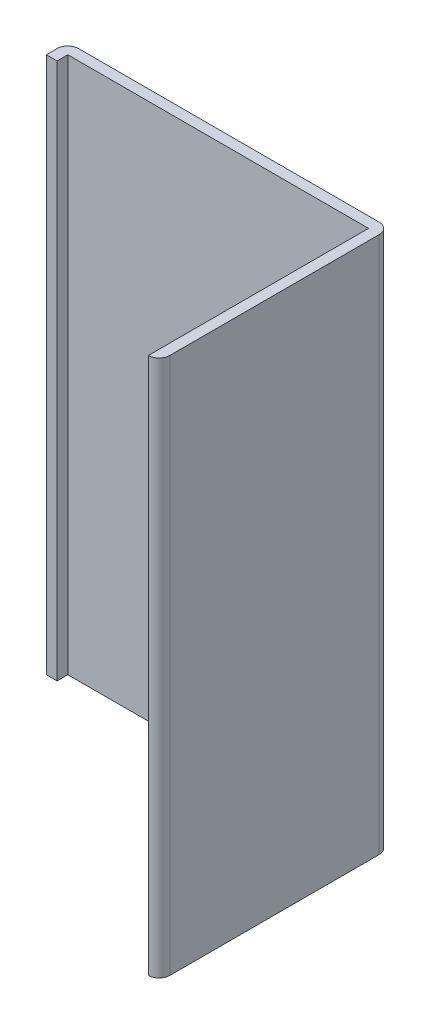
ISO-10303-21;
HEADER;
FILE_DESCRIPTION(('STEP AP214'),'2;1');
FILE_NAME('part.step','',(''),(''),'','','');
FILE_SCHEMA(('AUTOMOTIVE_DESIGN { 1 0 10303 214 1 1 1 1 }'));
ENDSEC;
DATA;
#1=APPLICATION_CONTEXT('core data for automotive mechanical design processes');
#2=APPLICATION_PROTOCOL_DEFINITION('international standard','automotive_design',2000,#1);
#3=PRODUCT_CONTEXT('',#1,'mechanical');
#4=PRODUCT('Part','Part','',(#3));
#5=PRODUCT_RELATED_PRODUCT_CATEGORY('part','',(#4));
#6=PRODUCT_DEFINITION_FORMATION('','',#4);
#7=PRODUCT_DEFINITION_CONTEXT('part definition',#1,'design');
#8=PRODUCT_DEFINITION('design','',#6,#7);
#9=PRODUCT_DEFINITION_SHAPE('','',#8);
#10=(LENGTH_UNIT() NAMED_UNIT(*) SI_UNIT(.MILLI.,.METRE.));
#11=(NAMED_UNIT(*) PLANE_ANGLE_UNIT() SI_UNIT($,.RADIAN.));
#12=(NAMED_UNIT(*) SI_UNIT($,.STERADIAN.) SOLID_ANGLE_UNIT());
#13=UNCERTAINTY_MEASURE_WITH_UNIT(LENGTH_MEASURE(1.E-05),#10,'distance_accuracy_value','');
#14=(GEOMETRIC_REPRESENTATION_CONTEXT(3) GLOBAL_UNCERTAINTY_ASSIGNED_CONTEXT((#13)) GLOBAL_UNIT_ASSIGNED_CONTEXT((#10,
#11,#12)) REPRESENTATION_CONTEXT('',''));
#15=CARTESIAN_POINT('',(0.,0.,0.));
#16=DIRECTION('',(0.,0.,1.));
#17=DIRECTION('',(1.,0.,0.));
#18=AXIS2_PLACEMENT_3D('',#15,#16,#17);
#19=CARTESIAN_POINT('',(-0.0762,-0.635,0.0254));
#20=DIRECTION('',(0.,0.,-1.));
#21=DIRECTION('',(-1.,0.,0.));
#22=AXIS2_PLACEMENT_3D('',#19,#20,#21);
#23=PLANE('',#22);
#24=DIRECTION('',(0.,1.,0.));
#25=VECTOR('',#24,1.);
#26=CARTESIAN_POINT('',(0.635,-0.635,0.0254));
#27=LINE('',#26,#25);
#28=CARTESIAN_POINT('',(0.635,-0.635,0.0254));
#29=VERTEX_POINT('',#28);
#30=CARTESIAN_POINT('',(0.635,0.635,0.0254));
#31=VERTEX_POINT('',#30);
#32=EDGE_CURVE('E125',#29,#31,#27,.T.);
#33=ORIENTED_EDGE('',*,*,#32,.T.);
#34=DIRECTION('',(1.,0.,0.));
#35=VECTOR('',#34,1.);
#36=CARTESIAN_POINT('',(0.635,0.635,0.0254));
#37=LINE('',#36,#35);
#38=CARTESIAN_POINT('',(-0.0762,0.635,0.0254));
#39=VERTEX_POINT('',#38);
#40=EDGE_CURVE('E112',#31,#39,#37,.F.);
#41=ORIENTED_EDGE('',*,*,#40,.T.);
#42=DIRECTION('',(0.,1.,0.));
#43=VECTOR('',#42,1.);
#44=CARTESIAN_POINT('',(-0.0762,-0.635,0.0254));
#45=LINE('',#44,#43);
#46=CARTESIAN_POINT('',(-0.0762,-0.635,0.0254));
#47=VERTEX_POINT('',#46);
#48=EDGE_CURVE('E108',#39,#47,#45,.F.);
#49=ORIENTED_EDGE('',*,*,#48,.T.);
#50=DIRECTION('',(1.,0.,0.));
#51=VECTOR('',#50,1.);
#52=CARTESIAN_POINT('',(0.635,-0.635,0.0254));
#53=LINE('',#52,#51);
#54=EDGE_CURVE('E126',#29,#47,#53,.F.);
#55=ORIENTED_EDGE('',*,*,#54,.F.);
#56=EDGE_LOOP('',(#33,#41,#49,#55));
#57=FACE_BOUND('',#56,.T.);
#58=ADVANCED_FACE('F17',(#57),#23,.F.);
#59=CARTESIAN_POINT('',(-0.0762,-0.635,0.0508));
#60=DIRECTION('',(-1.,0.,0.));
#61=DIRECTION('',(0.,0.,1.));
#62=AXIS2_PLACEMENT_3D('',#59,#60,#61);
#63=PLANE('',#62);
#64=ORIENTED_EDGE('',*,*,#48,.F.);
#65=DIRECTION('',(0.,0.,-1.));
#66=VECTOR('',#65,1.);
#67=CARTESIAN_POINT('',(-0.0762,0.635,0.0254));
#68=LINE('',#67,#66);
#69=CARTESIAN_POINT('',(-0.0762,0.635,0.0508));
#70=VERTEX_POINT('',#69);
#71=EDGE_CURVE('E120',#39,#70,#68,.F.);
#72=ORIENTED_EDGE('',*,*,#71,.T.);
#73=DIRECTION('',(0.,1.,0.));
#74=VECTOR('',#73,1.);
#75=CARTESIAN_POINT('',(-0.0762,-0.635,0.0508));
#76=LINE('',#75,#74);
#77=CARTESIAN_POINT('',(-0.0762,-0.635,0.0508));
#78=VERTEX_POINT('',#77);
#79=EDGE_CURVE('E177',#70,#78,#76,.F.);
#80=ORIENTED_EDGE('',*,*,#79,.T.);
#81=DIRECTION('',(0.,0.,-1.));
#82=VECTOR('',#81,1.);
#83=CARTESIAN_POINT('',(-0.0762,-0.635,0.0254));
#84=LINE('',#83,#82);
#85=EDGE_CURVE('E168',#47,#78,#84,.F.);
#86=ORIENTED_EDGE('',*,*,#85,.F.);
#87=EDGE_LOOP('',(#64,#72,#80,#86));
#88=FACE_BOUND('',#87,.T.);
#89=ADVANCED_FACE('F227',(#88),#63,.F.);
#90=CARTESIAN_POINT('',(-0.1016,-0.635,0.0508));
#91=DIRECTION('',(0.,0.,-1.));
#92=DIRECTION('',(-1.,0.,0.));
#93=AXIS2_PLACEMENT_3D('',#90,#91,#92);
#94=PLANE('',#93);
#95=ORIENTED_EDGE('',*,*,#79,.F.);
#96=DIRECTION('',(1.,0.,0.));
#97=VECTOR('',#96,1.);
#98=CARTESIAN_POINT('',(0.635,0.635,0.0508));
#99=LINE('',#98,#97);
#100=CARTESIAN_POINT('',(-0.1016,0.635,0.0508));
#101=VERTEX_POINT('',#100);
#102=EDGE_CURVE('E145',#70,#101,#99,.F.);
#103=ORIENTED_EDGE('',*,*,#102,.T.);
#104=DIRECTION('',(0.,1.,0.));
#105=VECTOR('',#104,1.);
#106=CARTESIAN_POINT('',(-0.1016,-0.635,0.0508));
#107=LINE('',#106,#105);
#108=CARTESIAN_POINT('',(-0.1016,-0.635,0.0508));
#109=VERTEX_POINT('',#108);
#110=EDGE_CURVE('E184',#101,#109,#107,.F.);
#111=ORIENTED_EDGE('',*,*,#110,.T.);
#112=DIRECTION('',(1.,0.,0.));
#113=VECTOR('',#112,1.);
#114=CARTESIAN_POINT('',(0.635,-0.635,0.0508));
#115=LINE('',#114,#113);
#116=EDGE_CURVE('E86',#78,#109,#115,.F.);
#117=ORIENTED_EDGE('',*,*,#116,.F.);
#118=EDGE_LOOP('',(#95,#103,#111,#117));
#119=FACE_BOUND('',#118,.T.);
#120=ADVANCED_FACE('F226',(#119),#94,.F.);
#121=CARTESIAN_POINT('',(-0.1016,-0.635,0.0254));
#122=DIRECTION('',(1.,0.,0.));
#123=DIRECTION('',(0.,0.,-1.));
#124=AXIS2_PLACEMENT_3D('',#121,#122,#123);
#125=PLANE('',#124);
#126=ORIENTED_EDGE('',*,*,#110,.F.);
#127=DIRECTION('',(0.,0.,-1.));
#128=VECTOR('',#127,1.);
#129=CARTESIAN_POINT('',(-0.1016,0.635,0.0254));
#130=LINE('',#129,#128);
#131=CARTESIAN_POINT('',(-0.1016,0.635,0.0254));
#132=VERTEX_POINT('',#131);
#133=EDGE_CURVE('E148',#101,#132,#130,.T.);
#134=ORIENTED_EDGE('',*,*,#133,.T.);
#135=DIRECTION('',(0.,-1.,0.));
#136=VECTOR('',#135,1.);
#137=CARTESIAN_POINT('',(-0.1016,-0.635,0.0254));
#138=LINE('',#137,#136);
#139=CARTESIAN_POINT('',(-0.1016,-0.635,0.0254));
#140=VERTEX_POINT('',#139);
#141=EDGE_CURVE('E134',#140,#132,#138,.F.);
#142=ORIENTED_EDGE('',*,*,#141,.F.);
#143=DIRECTION('',(0.,0.,-1.));
#144=VECTOR('',#143,1.);
#145=CARTESIAN_POINT('',(-0.1016,-0.635,0.0254));
#146=LINE('',#145,#144);
#147=EDGE_CURVE('E80',#109,#140,#146,.T.);
#148=ORIENTED_EDGE('',*,*,#147,.F.);
#149=EDGE_LOOP('',(#126,#134,#142,#148));
#150=FACE_BOUND('',#149,.T.);
#151=ADVANCED_FACE('F224',(#150),#125,.F.);
#152=CARTESIAN_POINT('',(0.6604,-0.635,0.5207));
#153=DIRECTION('',(-1.,0.,0.));
#154=DIRECTION('',(0.,0.,1.));
#155=AXIS2_PLACEMENT_3D('',#152,#153,#154);
#156=PLANE('',#155);
#157=DIRECTION('',(0.,-1.,0.));
#158=VECTOR('',#157,1.);
#159=CARTESIAN_POINT('',(0.6604,-0.635,0.0254));
#160=LINE('',#159,#158);
#161=CARTESIAN_POINT('',(0.6604,0.635,0.0254));
#162=VERTEX_POINT('',#161);
#163=CARTESIAN_POINT('',(0.6604,-0.635,0.0254));
#164=VERTEX_POINT('',#163);
#165=EDGE_CURVE('E74',#162,#164,#160,.T.);
#166=ORIENTED_EDGE('',*,*,#165,.F.);
#167=DIRECTION('',(0.,0.,-1.));
#168=VECTOR('',#167,1.);
#169=CARTESIAN_POINT('',(0.6604,0.635,0.0254));
#170=LINE('',#169,#168);
#171=CARTESIAN_POINT('',(0.6604,0.635,0.5207));
#172=VERTEX_POINT('',#171);
#173=EDGE_CURVE('E139',#162,#172,#170,.F.);
#174=ORIENTED_EDGE('',*,*,#173,.T.);
#175=DIRECTION('',(0.,-1.,0.));
#176=VECTOR('',#175,1.);
#177=CARTESIAN_POINT('',(0.6604,-0.635,0.5207));
#178=LINE('',#177,#176);
#179=CARTESIAN_POINT('',(0.6604,-0.635,0.5207));
#180=VERTEX_POINT('',#179);
#181=EDGE_CURVE('E190',#180,#172,#178,.F.);
#182=ORIENTED_EDGE('',*,*,#181,.F.);
#183=DIRECTION('',(0.,0.,-1.));
#184=VECTOR('',#183,1.);
#185=CARTESIAN_POINT('',(0.6604,-0.635,0.0254));
#186=LINE('',#185,#184);
#187=EDGE_CURVE('E160',#164,#180,#186,.F.);
#188=ORIENTED_EDGE('',*,*,#187,.F.);
#189=EDGE_LOOP('',(#166,#174,#182,#188));
#190=FACE_BOUND('',#189,.T.);
#191=ADVANCED_FACE('F216',(#190),#156,.F.);
#192=CARTESIAN_POINT('',(0.635,-0.635,0.5207));
#193=DIRECTION('',(0.,-1.,0.));
#194=DIRECTION('',(0.,0.,-1.));
#195=AXIS2_PLACEMENT_3D('',#192,#193,#194);
#196=CYLINDRICAL_SURFACE('',#195,0.0254);
#197=CARTESIAN_POINT('',(0.635,0.635,0.5207));
#198=DIRECTION('',(0.,-1.,0.));
#199=DIRECTION('',(0.,0.,-1.));
#200=AXIS2_PLACEMENT_3D('',#197,#198,#199);
#201=CIRCLE('',#200,0.0254);
#202=CARTESIAN_POINT('',(0.635,0.635,0.5461));
#203=VERTEX_POINT('',#202);
#204=EDGE_CURVE('E135',#172,#203,#201,.T.);
#205=ORIENTED_EDGE('',*,*,#204,.T.);
#206=DIRECTION('',(0.,1.,0.));
#207=VECTOR('',#206,1.);
#208=CARTESIAN_POINT('',(0.635,-0.635,0.5461));
#209=LINE('',#208,#207);
#210=CARTESIAN_POINT('',(0.635,-0.635,0.5461));
#211=VERTEX_POINT('',#210);
#212=EDGE_CURVE('E129',#203,#211,#209,.F.);
#213=ORIENTED_EDGE('',*,*,#212,.T.);
#214=CARTESIAN_POINT('',(0.635,-0.635,0.5207));
#215=DIRECTION('',(0.,-1.,0.));
#216=DIRECTION('',(0.,0.,-1.));
#217=AXIS2_PLACEMENT_3D('',#214,#215,#216);
#218=CIRCLE('',#217,0.0254);
#219=EDGE_CURVE('E156',#180,#211,#218,.T.);
#220=ORIENTED_EDGE('',*,*,#219,.F.);
#221=ORIENTED_EDGE('',*,*,#181,.T.);
#222=EDGE_LOOP('',(#205,#213,#220,#221));
#223=FACE_BOUND('',#222,.T.);
#224=ADVANCED_FACE('F218',(#223),#196,.T.);
#225=CARTESIAN_POINT('',(0.635,-0.635,0.0254));
#226=DIRECTION('',(1.,0.,0.));
#227=DIRECTION('',(0.,0.,-1.));
#228=AXIS2_PLACEMENT_3D('',#225,#226,#227);
#229=PLANE('',#228);
#230=DIRECTION('',(0.,0.,-1.));
#231=VECTOR('',#230,1.);
#232=CARTESIAN_POINT('',(0.635,-0.635,0.0254));
#233=LINE('',#232,#231);
#234=EDGE_CURVE('E159',#211,#29,#233,.T.);
#235=ORIENTED_EDGE('',*,*,#234,.F.);
#236=ORIENTED_EDGE('',*,*,#212,.F.);
#237=DIRECTION('',(0.,0.,-1.));
#238=VECTOR('',#237,1.);
#239=CARTESIAN_POINT('',(0.635,0.635,0.0254));
#240=LINE('',#239,#238);
#241=EDGE_CURVE('E117',#203,#31,#240,.T.);
#242=ORIENTED_EDGE('',*,*,#241,.T.);
#243=ORIENTED_EDGE('',*,*,#32,.F.);
#244=EDGE_LOOP('',(#235,#236,#242,#243));
#245=FACE_BOUND('',#244,.T.);
#246=ADVANCED_FACE('F131',(#245),#229,.F.);
#247=CARTESIAN_POINT('',(0.635,-0.635,0.0254));
#248=DIRECTION('',(0.,-1.,0.));
#249=DIRECTION('',(0.,0.,-1.));
#250=AXIS2_PLACEMENT_3D('',#247,#248,#249);
#251=CYLINDRICAL_SURFACE('',#250,0.0254);
#252=CARTESIAN_POINT('',(0.635,0.635,0.0254));
#253=DIRECTION('',(0.,-1.,0.));
#254=DIRECTION('',(0.,0.,-1.));
#255=AXIS2_PLACEMENT_3D('',#252,#253,#254);
#256=CIRCLE('',#255,0.0254);
#257=CARTESIAN_POINT('',(0.635,0.635,0.));
#258=VERTEX_POINT('',#257);
#259=EDGE_CURVE('E20',#258,#162,#256,.T.);
#260=ORIENTED_EDGE('',*,*,#259,.T.);
#261=ORIENTED_EDGE('',*,*,#165,.T.);
#262=CARTESIAN_POINT('',(0.635,-0.635,0.0254));
#263=DIRECTION('',(0.,-1.,0.));
#264=DIRECTION('',(0.,0.,-1.));
#265=AXIS2_PLACEMENT_3D('',#262,#263,#264);
#266=CIRCLE('',#265,0.0254);
#267=CARTESIAN_POINT('',(0.635,-0.635,0.));
#268=VERTEX_POINT('',#267);
#269=EDGE_CURVE('E161',#268,#164,#266,.T.);
#270=ORIENTED_EDGE('',*,*,#269,.F.);
#271=DIRECTION('',(0.,1.,0.));
#272=VECTOR('',#271,1.);
#273=CARTESIAN_POINT('',(0.635,-0.635,0.));
#274=LINE('',#273,#272);
#275=EDGE_CURVE('E64',#268,#258,#274,.T.);
#276=ORIENTED_EDGE('',*,*,#275,.T.);
#277=EDGE_LOOP('',(#260,#261,#270,#276));
#278=FACE_BOUND('',#277,.T.);
#279=ADVANCED_FACE('F219',(#278),#251,.T.);
#280=CARTESIAN_POINT('',(0.635,0.635,0.0254));
#281=DIRECTION('',(0.,-1.,0.));
#282=DIRECTION('',(0.,0.,-1.));
#283=AXIS2_PLACEMENT_3D('',#280,#281,#282);
#284=PLANE('',#283);
#285=ORIENTED_EDGE('',*,*,#241,.F.);
#286=ORIENTED_EDGE('',*,*,#204,.F.);
#287=ORIENTED_EDGE('',*,*,#173,.F.);
#288=ORIENTED_EDGE('',*,*,#259,.F.);
#289=DIRECTION('',(1.,0.,0.));
#290=VECTOR('',#289,1.);
#291=CARTESIAN_POINT('',(0.635,0.635,0.));
#292=LINE('',#291,#290);
#293=CARTESIAN_POINT('',(-0.0762,0.635,0.));
#294=VERTEX_POINT('',#293);
#295=EDGE_CURVE('E204',#258,#294,#292,.F.);
#296=ORIENTED_EDGE('',*,*,#295,.T.);
#297=CARTESIAN_POINT('',(-0.0762,0.635,0.0254));
#298=DIRECTION('',(0.,-1.,0.));
#299=DIRECTION('',(0.,0.,-1.));
#300=AXIS2_PLACEMENT_3D('',#297,#298,#299);
#301=CIRCLE('',#300,0.0254);
#302=EDGE_CURVE('E137',#132,#294,#301,.T.);
#303=ORIENTED_EDGE('',*,*,#302,.F.);
#304=ORIENTED_EDGE('',*,*,#133,.F.);
#305=ORIENTED_EDGE('',*,*,#102,.F.);
#306=ORIENTED_EDGE('',*,*,#71,.F.);
#307=ORIENTED_EDGE('',*,*,#40,.F.);
#308=EDGE_LOOP('',(#285,#286,#287,#288,#296,#303,#304,#305,#306,#307));
#309=FACE_BOUND('',#308,.T.);
#310=ADVANCED_FACE('F114',(#309),#284,.F.);
#311=CARTESIAN_POINT('',(-0.0762,-0.635,0.0254));
#312=DIRECTION('',(0.,-1.,0.));
#313=DIRECTION('',(0.,0.,-1.));
#314=AXIS2_PLACEMENT_3D('',#311,#312,#313);
#315=CYLINDRICAL_SURFACE('',#314,0.0254);
#316=ORIENTED_EDGE('',*,*,#302,.T.);
#317=DIRECTION('',(0.,1.,0.));
#318=VECTOR('',#317,1.);
#319=CARTESIAN_POINT('',(-0.0762,-0.635,0.));
#320=LINE('',#319,#318);
#321=CARTESIAN_POINT('',(-0.0762,-0.635,0.));
#322=VERTEX_POINT('',#321);
#323=EDGE_CURVE('E26',#294,#322,#320,.F.);
#324=ORIENTED_EDGE('',*,*,#323,.T.);
#325=CARTESIAN_POINT('',(-0.0762,-0.635,0.0254));
#326=DIRECTION('',(0.,-1.,0.));
#327=DIRECTION('',(0.,0.,-1.));
#328=AXIS2_PLACEMENT_3D('',#325,#326,#327);
#329=CIRCLE('',#328,0.0254);
#330=EDGE_CURVE('E34',#140,#322,#329,.T.);
#331=ORIENTED_EDGE('',*,*,#330,.F.);
#332=ORIENTED_EDGE('',*,*,#141,.T.);
#333=EDGE_LOOP('',(#316,#324,#331,#332));
#334=FACE_BOUND('',#333,.T.);
#335=ADVANCED_FACE('F221',(#334),#315,.T.);
#336=CARTESIAN_POINT('',(0.635,-0.635,0.0254));
#337=DIRECTION('',(0.,-1.,0.));
#338=DIRECTION('',(0.,0.,-1.));
#339=AXIS2_PLACEMENT_3D('',#336,#337,#338);
#340=PLANE('',#339);
#341=ORIENTED_EDGE('',*,*,#219,.T.);
#342=ORIENTED_EDGE('',*,*,#234,.T.);
#343=ORIENTED_EDGE('',*,*,#54,.T.);
#344=ORIENTED_EDGE('',*,*,#85,.T.);
#345=ORIENTED_EDGE('',*,*,#116,.T.);
#346=ORIENTED_EDGE('',*,*,#147,.T.);
#347=ORIENTED_EDGE('',*,*,#330,.T.);
#348=DIRECTION('',(1.,0.,0.));
#349=VECTOR('',#348,1.);
#350=CARTESIAN_POINT('',(0.635,-0.635,0.));
#351=LINE('',#350,#349);
#352=EDGE_CURVE('E11',#322,#268,#351,.T.);
#353=ORIENTED_EDGE('',*,*,#352,.T.);
#354=ORIENTED_EDGE('',*,*,#269,.T.);
#355=ORIENTED_EDGE('',*,*,#187,.T.);
#356=EDGE_LOOP('',(#341,#342,#343,#344,#345,#346,#347,#353,#354,#355));
#357=FACE_BOUND('',#356,.T.);
#358=ADVANCED_FACE('F213',(#357),#340,.T.);
#359=CARTESIAN_POINT('',(0.635,-0.635,0.));
#360=DIRECTION('',(0.,0.,1.));
#361=DIRECTION('',(1.,0.,0.));
#362=AXIS2_PLACEMENT_3D('',#359,#360,#361);
#363=PLANE('',#362);
#364=ORIENTED_EDGE('',*,*,#323,.F.);
#365=ORIENTED_EDGE('',*,*,#295,.F.);
#366=ORIENTED_EDGE('',*,*,#275,.F.);
#367=ORIENTED_EDGE('',*,*,#352,.F.);
#368=EDGE_LOOP('',(#364,#365,#366,#367));
#369=FACE_BOUND('',#368,.T.);
#370=ADVANCED_FACE('F220',(#369),#363,.F.);
#371=CLOSED_SHELL('',(#58,#89,#120,#151,#191,#224,#246,#279,#310,#335,#358,#370));
#372=MANIFOLD_SOLID_BREP('B1',#371);
#373=ADVANCED_BREP_SHAPE_REPRESENTATION('',(#18,#372),#14);
#374=SHAPE_DEFINITION_REPRESENTATION(#9,#373);
ENDSEC;
END-ISO-10303-21;
